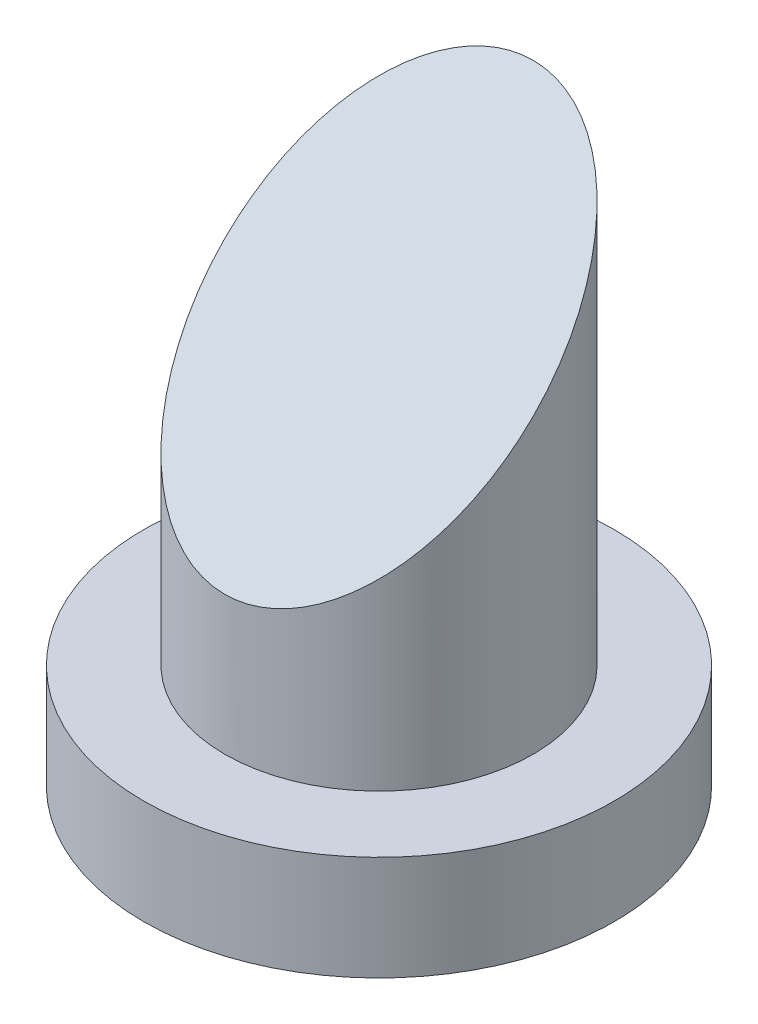
ISO-10303-21;
HEADER;
FILE_DESCRIPTION(('STEP AP214'),'2;1');
FILE_NAME('part.step','',(''),(''),'','','');
FILE_SCHEMA(('AUTOMOTIVE_DESIGN { 1 0 10303 214 1 1 1 1 }'));
ENDSEC;
DATA;
#1=APPLICATION_CONTEXT('core data for automotive mechanical design processes');
#2=APPLICATION_PROTOCOL_DEFINITION('international standard','automotive_design',2000,#1);
#3=PRODUCT_CONTEXT('',#1,'mechanical');
#4=PRODUCT('Part','Part','',(#3));
#5=PRODUCT_RELATED_PRODUCT_CATEGORY('part','',(#4));
#6=PRODUCT_DEFINITION_FORMATION('','',#4);
#7=PRODUCT_DEFINITION_CONTEXT('part definition',#1,'design');
#8=PRODUCT_DEFINITION('design','',#6,#7);
#9=PRODUCT_DEFINITION_SHAPE('','',#8);
#10=(LENGTH_UNIT() NAMED_UNIT(*) SI_UNIT(.MILLI.,.METRE.));
#11=(NAMED_UNIT(*) PLANE_ANGLE_UNIT() SI_UNIT($,.RADIAN.));
#12=(NAMED_UNIT(*) SI_UNIT($,.STERADIAN.) SOLID_ANGLE_UNIT());
#13=UNCERTAINTY_MEASURE_WITH_UNIT(LENGTH_MEASURE(1.E-05),#10,'distance_accuracy_value','');
#14=(GEOMETRIC_REPRESENTATION_CONTEXT(3) GLOBAL_UNCERTAINTY_ASSIGNED_CONTEXT((#13)) GLOBAL_UNIT_ASSIGNED_CONTEXT((#10,
#11,#12)) REPRESENTATION_CONTEXT('',''));
#15=CARTESIAN_POINT('',(0.,0.,0.));
#16=DIRECTION('',(0.,0.,1.));
#17=DIRECTION('',(1.,0.,0.));
#18=AXIS2_PLACEMENT_3D('',#15,#16,#17);
#19=CARTESIAN_POINT('',(0.,4.,0.));
#20=DIRECTION('',(0.,-1.,0.));
#21=DIRECTION('',(0.,0.,-1.));
#22=AXIS2_PLACEMENT_3D('',#19,#20,#21);
#23=CYLINDRICAL_SURFACE('',#22,9.);
#24=CARTESIAN_POINT('',(0.,4.,0.));
#25=DIRECTION('',(0.,1.,0.));
#26=DIRECTION('',(0.,0.,1.));
#27=AXIS2_PLACEMENT_3D('',#24,#25,#26);
#28=CIRCLE('',#27,9.);
#29=CARTESIAN_POINT('',(0.,4.,9.));
#30=VERTEX_POINT('',#29);
#31=EDGE_CURVE('E45',#30,#30,#28,.T.);
#32=ORIENTED_EDGE('',*,*,#31,.F.);
#33=EDGE_LOOP('',(#32));
#34=FACE_BOUND('',#33,.T.);
#35=CARTESIAN_POINT('',(0.,0.,0.));
#36=DIRECTION('',(0.,1.,0.));
#37=DIRECTION('',(0.,0.,1.));
#38=AXIS2_PLACEMENT_3D('',#35,#36,#37);
#39=CIRCLE('',#38,9.);
#40=CARTESIAN_POINT('',(0.,0.,9.));
#41=VERTEX_POINT('',#40);
#42=EDGE_CURVE('E51',#41,#41,#39,.T.);
#43=ORIENTED_EDGE('',*,*,#42,.T.);
#44=EDGE_LOOP('',(#43));
#45=FACE_BOUND('',#44,.T.);
#46=ADVANCED_FACE('F37',(#34,#45),#23,.T.);
#47=CARTESIAN_POINT('',(0.,4.,0.));
#48=DIRECTION('',(0.,1.,0.));
#49=DIRECTION('',(0.,0.,1.));
#50=AXIS2_PLACEMENT_3D('',#47,#48,#49);
#51=PLANE('',#50);
#52=CARTESIAN_POINT('',(0.,4.,0.));
#53=DIRECTION('',(0.,1.,0.));
#54=DIRECTION('',(0.,0.,1.));
#55=AXIS2_PLACEMENT_3D('',#52,#53,#54);
#56=CIRCLE('',#55,5.9);
#57=CARTESIAN_POINT('',(0.,4.,5.9));
#58=VERTEX_POINT('',#57);
#59=EDGE_CURVE('E10',#58,#58,#56,.T.);
#60=ORIENTED_EDGE('',*,*,#59,.F.);
#61=EDGE_LOOP('',(#60));
#62=FACE_BOUND('',#61,.T.);
#63=ORIENTED_EDGE('',*,*,#31,.T.);
#64=EDGE_LOOP('',(#63));
#65=FACE_BOUND('',#64,.T.);
#66=ADVANCED_FACE('F79',(#62,#65),#51,.T.);
#67=CARTESIAN_POINT('',(0.,0.,0.));
#68=DIRECTION('',(0.,1.,0.));
#69=DIRECTION('',(0.,0.,1.));
#70=AXIS2_PLACEMENT_3D('',#67,#68,#69);
#71=PLANE('',#70);
#72=CARTESIAN_POINT('',(0.,0.,-6.));
#73=DIRECTION('',(0.,-1.,0.));
#74=DIRECTION('',(0.,0.,-1.));
#75=AXIS2_PLACEMENT_3D('',#72,#73,#74);
#76=CIRCLE('',#75,0.425);
#77=CARTESIAN_POINT('',(0.,0.,-6.425));
#78=VERTEX_POINT('',#77);
#79=EDGE_CURVE('E54',#78,#78,#76,.T.);
#80=ORIENTED_EDGE('',*,*,#79,.F.);
#81=EDGE_LOOP('',(#80));
#82=FACE_BOUND('',#81,.T.);
#83=ORIENTED_EDGE('',*,*,#42,.F.);
#84=EDGE_LOOP('',(#83));
#85=FACE_BOUND('',#84,.T.);
#86=ADVANCED_FACE('F75',(#82,#85),#71,.F.);
#87=CARTESIAN_POINT('',(0.,24.,0.));
#88=DIRECTION('',(0.,-1.,0.));
#89=DIRECTION('',(0.,0.,-1.));
#90=AXIS2_PLACEMENT_3D('',#87,#88,#89);
#91=CYLINDRICAL_SURFACE('',#90,5.9);
#92=CARTESIAN_POINT('',(0.,15.2,0.));
#93=DIRECTION('',(0.,-0.707106781186547,-0.707106781186548));
#94=DIRECTION('',(0.,-0.707106781186548,0.707106781186547));
#95=AXIS2_PLACEMENT_3D('',#92,#93,#94);
#96=ELLIPSE('',#95,8.34386001800127,5.9);
#97=CARTESIAN_POINT('',(0.,9.29999999999999,5.9));
#98=VERTEX_POINT('',#97);
#99=EDGE_CURVE('E40',#98,#98,#96,.T.);
#100=ORIENTED_EDGE('',*,*,#99,.T.);
#101=EDGE_LOOP('',(#100));
#102=FACE_BOUND('',#101,.T.);
#103=ORIENTED_EDGE('',*,*,#59,.T.);
#104=EDGE_LOOP('',(#103));
#105=FACE_BOUND('',#104,.T.);
#106=ADVANCED_FACE('F78',(#102,#105),#91,.T.);
#107=CARTESIAN_POINT('',(-9.,7.59999999999999,7.6));
#108=DIRECTION('',(0.,-0.707106781186547,-0.707106781186548));
#109=DIRECTION('',(0.,0.707106781186548,-0.707106781186547));
#110=AXIS2_PLACEMENT_3D('',#107,#108,#109);
#111=PLANE('',#110);
#112=ORIENTED_EDGE('',*,*,#99,.F.);
#113=EDGE_LOOP('',(#112));
#114=FACE_BOUND('',#113,.T.);
#115=ADVANCED_FACE('F84',(#114),#111,.F.);
#116=CARTESIAN_POINT('',(0.,1.5,-6.));
#117=DIRECTION('',(0.,-1.,0.));
#118=DIRECTION('',(0.,0.,-1.));
#119=AXIS2_PLACEMENT_3D('',#116,#117,#118);
#120=CYLINDRICAL_SURFACE('',#119,0.425);
#121=CARTESIAN_POINT('',(0.,1.5,-6.));
#122=DIRECTION('',(0.,-1.,0.));
#123=DIRECTION('',(0.,0.,-1.));
#124=AXIS2_PLACEMENT_3D('',#121,#122,#123);
#125=CIRCLE('',#124,0.425);
#126=CARTESIAN_POINT('',(0.,1.5,-6.425));
#127=VERTEX_POINT('',#126);
#128=EDGE_CURVE('E62',#127,#127,#125,.T.);
#129=ORIENTED_EDGE('',*,*,#128,.F.);
#130=EDGE_LOOP('',(#129));
#131=FACE_BOUND('',#130,.T.);
#132=ORIENTED_EDGE('',*,*,#79,.T.);
#133=EDGE_LOOP('',(#132));
#134=FACE_BOUND('',#133,.T.);
#135=ADVANCED_FACE('F73',(#131,#134),#120,.F.);
#136=CARTESIAN_POINT('',(0.,1.5,-6.));
#137=DIRECTION('',(0.,-1.,0.));
#138=DIRECTION('',(0.,0.,-1.));
#139=AXIS2_PLACEMENT_3D('',#136,#137,#138);
#140=PLANE('',#139);
#141=ORIENTED_EDGE('',*,*,#128,.T.);
#142=EDGE_LOOP('',(#141));
#143=FACE_BOUND('',#142,.T.);
#144=ADVANCED_FACE('F126',(#143),#140,.T.);
#145=CLOSED_SHELL('',(#46,#66,#86,#106,#115,#135,#144));
#146=MANIFOLD_SOLID_BREP('B2',#145);
#147=ADVANCED_BREP_SHAPE_REPRESENTATION('',(#18,#146),#14);
#148=SHAPE_DEFINITION_REPRESENTATION(#9,#147);
ENDSEC;
END-ISO-10303-21;
